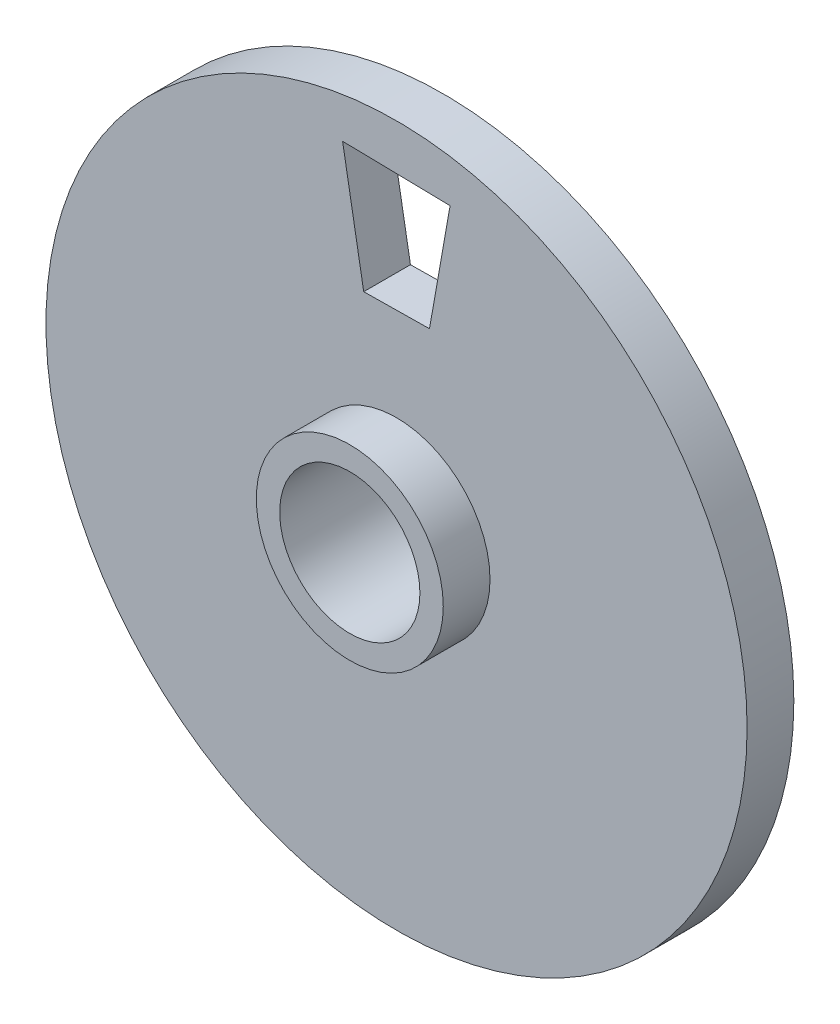
ISO-10303-21;
HEADER;
FILE_DESCRIPTION(('STEP AP214'),'2;1');
FILE_NAME('part.step','',(''),(''),'','','');
FILE_SCHEMA(('AUTOMOTIVE_DESIGN { 1 0 10303 214 1 1 1 1 }'));
ENDSEC;
DATA;
#1=APPLICATION_CONTEXT('core data for automotive mechanical design processes');
#2=APPLICATION_PROTOCOL_DEFINITION('international standard','automotive_design',2000,#1);
#3=PRODUCT_CONTEXT('',#1,'mechanical');
#4=PRODUCT('Part','Part','',(#3));
#5=PRODUCT_RELATED_PRODUCT_CATEGORY('part','',(#4));
#6=PRODUCT_DEFINITION_FORMATION('','',#4);
#7=PRODUCT_DEFINITION_CONTEXT('part definition',#1,'design');
#8=PRODUCT_DEFINITION('design','',#6,#7);
#9=PRODUCT_DEFINITION_SHAPE('','',#8);
#10=(LENGTH_UNIT() NAMED_UNIT(*) SI_UNIT(.MILLI.,.METRE.));
#11=(NAMED_UNIT(*) PLANE_ANGLE_UNIT() SI_UNIT($,.RADIAN.));
#12=(NAMED_UNIT(*) SI_UNIT($,.STERADIAN.) SOLID_ANGLE_UNIT());
#13=UNCERTAINTY_MEASURE_WITH_UNIT(LENGTH_MEASURE(1.E-05),#10,'distance_accuracy_value','');
#14=(GEOMETRIC_REPRESENTATION_CONTEXT(3) GLOBAL_UNCERTAINTY_ASSIGNED_CONTEXT((#13)) GLOBAL_UNIT_ASSIGNED_CONTEXT((#10,
#11,#12)) REPRESENTATION_CONTEXT('',''));
#15=CARTESIAN_POINT('',(0.,0.,0.));
#16=DIRECTION('',(0.,0.,1.));
#17=DIRECTION('',(1.,0.,0.));
#18=AXIS2_PLACEMENT_3D('',#15,#16,#17);
#19=CARTESIAN_POINT('',(0.,0.,4.));
#20=DIRECTION('',(0.,0.,1.));
#21=DIRECTION('',(1.,0.,0.));
#22=AXIS2_PLACEMENT_3D('',#19,#20,#21);
#23=PLANE('',#22);
#24=DIRECTION('',(0.173648177670117,0.984807753011646,0.));
#25=VECTOR('',#24,1.);
#26=CARTESIAN_POINT('',(2.29225074924466,13.,4.));
#27=LINE('',#26,#25);
#28=CARTESIAN_POINT('',(1.41061584568902,8.0000000000191,4.));
#29=VERTEX_POINT('',#28);
#30=CARTESIAN_POINT('',(2.29225074924466,13.,4.));
#31=VERTEX_POINT('',#30);
#32=EDGE_CURVE('E88',#29,#31,#27,.T.);
#33=ORIENTED_EDGE('',*,*,#32,.F.);
#34=DIRECTION('',(0.999915792669524,0.0129771942298062,0.));
#35=VECTOR('',#34,1.);
#36=CARTESIAN_POINT('',(1.41061584568902,8.0000000000191,4.));
#37=LINE('',#36,#35);
#38=CARTESIAN_POINT('',(-1.4041744171991,7.96346884387029,4.));
#39=VERTEX_POINT('',#38);
#40=EDGE_CURVE('E80',#39,#29,#37,.T.);
#41=ORIENTED_EDGE('',*,*,#40,.F.);
#42=DIRECTION('',(0.173648177666148,-0.984807753012346,0.));
#43=VECTOR('',#42,1.);
#44=CARTESIAN_POINT('',(-1.4041744171991,7.96346884387029,4.));
#45=LINE('',#44,#43);
#46=CARTESIAN_POINT('',(-2.3074497358179,13.0861977364863,4.));
#47=VERTEX_POINT('',#46);
#48=EDGE_CURVE('E103',#47,#39,#45,.T.);
#49=ORIENTED_EDGE('',*,*,#48,.F.);
#50=DIRECTION('',(-0.999824455085513,0.0187365688683103,0.));
#51=VECTOR('',#50,1.);
#52=CARTESIAN_POINT('',(-2.3074497358179,13.0861977364863,4.));
#53=LINE('',#52,#51);
#54=EDGE_CURVE('E101',#31,#47,#53,.T.);
#55=ORIENTED_EDGE('',*,*,#54,.F.);
#56=EDGE_LOOP('',(#33,#41,#49,#55));
#57=FACE_BOUND('',#56,.T.);
#58=CARTESIAN_POINT('',(0.,0.,4.));
#59=DIRECTION('',(0.,0.,1.));
#60=DIRECTION('',(1.,0.,0.));
#61=AXIS2_PLACEMENT_3D('',#58,#59,#60);
#62=CIRCLE('',#61,15.);
#63=CARTESIAN_POINT('',(15.,0.,4.));
#64=VERTEX_POINT('',#63);
#65=EDGE_CURVE('E119',#64,#64,#62,.T.);
#66=ORIENTED_EDGE('',*,*,#65,.T.);
#67=EDGE_LOOP('',(#66));
#68=FACE_BOUND('',#67,.T.);
#69=CARTESIAN_POINT('',(0.,0.,4.));
#70=DIRECTION('',(0.,0.,1.));
#71=DIRECTION('',(1.,0.,0.));
#72=AXIS2_PLACEMENT_3D('',#69,#70,#71);
#73=CIRCLE('',#72,4.);
#74=CARTESIAN_POINT('',(4.,0.,4.));
#75=VERTEX_POINT('',#74);
#76=EDGE_CURVE('E180',#75,#75,#73,.T.);
#77=ORIENTED_EDGE('',*,*,#76,.F.);
#78=EDGE_LOOP('',(#77));
#79=FACE_BOUND('',#78,.T.);
#80=ADVANCED_FACE('F39',(#57,#68,#79),#23,.T.);
#81=CARTESIAN_POINT('',(0.,0.,0.));
#82=DIRECTION('',(0.,0.,1.));
#83=DIRECTION('',(1.,0.,0.));
#84=AXIS2_PLACEMENT_3D('',#81,#82,#83);
#85=PLANE('',#84);
#86=CARTESIAN_POINT('',(0.,0.,0.));
#87=DIRECTION('',(0.,0.,1.));
#88=DIRECTION('',(1.,0.,0.));
#89=AXIS2_PLACEMENT_3D('',#86,#87,#88);
#90=CIRCLE('',#89,4.);
#91=CARTESIAN_POINT('',(4.,0.,0.));
#92=VERTEX_POINT('',#91);
#93=EDGE_CURVE('E43',#92,#92,#90,.T.);
#94=ORIENTED_EDGE('',*,*,#93,.F.);
#95=EDGE_LOOP('',(#94));
#96=FACE_BOUND('',#95,.T.);
#97=CARTESIAN_POINT('',(0.,0.,0.));
#98=DIRECTION('',(0.,0.,1.));
#99=DIRECTION('',(1.,0.,0.));
#100=AXIS2_PLACEMENT_3D('',#97,#98,#99);
#101=CIRCLE('',#100,3.);
#102=CARTESIAN_POINT('',(3.,0.,0.));
#103=VERTEX_POINT('',#102);
#104=EDGE_CURVE('E122',#103,#103,#101,.T.);
#105=ORIENTED_EDGE('',*,*,#104,.T.);
#106=EDGE_LOOP('',(#105));
#107=FACE_BOUND('',#106,.T.);
#108=ADVANCED_FACE('F132',(#96,#107),#85,.F.);
#109=CARTESIAN_POINT('',(0.,0.,2.));
#110=DIRECTION('',(0.,0.,-1.));
#111=DIRECTION('',(-1.,0.,0.));
#112=AXIS2_PLACEMENT_3D('',#109,#110,#111);
#113=CYLINDRICAL_SURFACE('',#112,4.);
#114=CARTESIAN_POINT('',(0.,0.,2.));
#115=DIRECTION('',(0.,0.,1.));
#116=DIRECTION('',(1.,0.,0.));
#117=AXIS2_PLACEMENT_3D('',#114,#115,#116);
#118=CIRCLE('',#117,4.);
#119=CARTESIAN_POINT('',(4.,0.,2.));
#120=VERTEX_POINT('',#119);
#121=EDGE_CURVE('E11',#120,#120,#118,.T.);
#122=ORIENTED_EDGE('',*,*,#121,.F.);
#123=EDGE_LOOP('',(#122));
#124=FACE_BOUND('',#123,.T.);
#125=ORIENTED_EDGE('',*,*,#93,.T.);
#126=EDGE_LOOP('',(#125));
#127=FACE_BOUND('',#126,.T.);
#128=ADVANCED_FACE('F41',(#124,#127),#113,.T.);
#129=CARTESIAN_POINT('',(0.,0.,2.));
#130=DIRECTION('',(0.,0.,-1.));
#131=DIRECTION('',(-1.,0.,0.));
#132=AXIS2_PLACEMENT_3D('',#129,#130,#131);
#133=CYLINDRICAL_SURFACE('',#132,3.);
#134=ORIENTED_EDGE('',*,*,#104,.F.);
#135=EDGE_LOOP('',(#134));
#136=FACE_BOUND('',#135,.T.);
#137=CARTESIAN_POINT('',(0.,0.,6.));
#138=DIRECTION('',(0.,0.,1.));
#139=DIRECTION('',(1.,0.,0.));
#140=AXIS2_PLACEMENT_3D('',#137,#138,#139);
#141=CIRCLE('',#140,3.);
#142=CARTESIAN_POINT('',(3.,0.,6.));
#143=VERTEX_POINT('',#142);
#144=EDGE_CURVE('E178',#143,#143,#141,.T.);
#145=ORIENTED_EDGE('',*,*,#144,.T.);
#146=EDGE_LOOP('',(#145));
#147=FACE_BOUND('',#146,.T.);
#148=ADVANCED_FACE('F138',(#136,#147),#133,.F.);
#149=CARTESIAN_POINT('',(0.,0.,2.));
#150=DIRECTION('',(0.,0.,1.));
#151=DIRECTION('',(1.,0.,0.));
#152=AXIS2_PLACEMENT_3D('',#149,#150,#151);
#153=PLANE('',#152);
#154=DIRECTION('',(0.999915792669524,0.0129771942298062,0.));
#155=VECTOR('',#154,1.);
#156=CARTESIAN_POINT('',(1.41061584568902,8.0000000000191,2.));
#157=LINE('',#156,#155);
#158=CARTESIAN_POINT('',(-1.4041744171991,7.9634688438703,2.));
#159=VERTEX_POINT('',#158);
#160=CARTESIAN_POINT('',(1.41061584568902,8.0000000000191,2.));
#161=VERTEX_POINT('',#160);
#162=EDGE_CURVE('E62',#159,#161,#157,.T.);
#163=ORIENTED_EDGE('',*,*,#162,.T.);
#164=DIRECTION('',(0.173648177670117,0.984807753011646,0.));
#165=VECTOR('',#164,1.);
#166=CARTESIAN_POINT('',(2.29225074924466,13.,2.));
#167=LINE('',#166,#165);
#168=CARTESIAN_POINT('',(2.29225074924466,13.,2.));
#169=VERTEX_POINT('',#168);
#170=EDGE_CURVE('E95',#161,#169,#167,.T.);
#171=ORIENTED_EDGE('',*,*,#170,.T.);
#172=DIRECTION('',(-0.999824455085513,0.0187365688683103,0.));
#173=VECTOR('',#172,1.);
#174=CARTESIAN_POINT('',(-2.3074497358179,13.0861977364863,2.));
#175=LINE('',#174,#173);
#176=CARTESIAN_POINT('',(-2.3074497358179,13.0861977364863,2.));
#177=VERTEX_POINT('',#176);
#178=EDGE_CURVE('E111',#169,#177,#175,.T.);
#179=ORIENTED_EDGE('',*,*,#178,.T.);
#180=DIRECTION('',(0.173648177666148,-0.984807753012346,0.));
#181=VECTOR('',#180,1.);
#182=CARTESIAN_POINT('',(-1.4041744171991,7.96346884387029,2.));
#183=LINE('',#182,#181);
#184=EDGE_CURVE('E89',#177,#159,#183,.T.);
#185=ORIENTED_EDGE('',*,*,#184,.T.);
#186=EDGE_LOOP('',(#163,#171,#179,#185));
#187=FACE_BOUND('',#186,.T.);
#188=CARTESIAN_POINT('',(0.,0.,2.));
#189=DIRECTION('',(0.,0.,1.));
#190=DIRECTION('',(1.,0.,0.));
#191=AXIS2_PLACEMENT_3D('',#188,#189,#190);
#192=CIRCLE('',#191,15.);
#193=CARTESIAN_POINT('',(15.,0.,2.));
#194=VERTEX_POINT('',#193);
#195=EDGE_CURVE('E96',#194,#194,#192,.T.);
#196=ORIENTED_EDGE('',*,*,#195,.F.);
#197=EDGE_LOOP('',(#196));
#198=FACE_BOUND('',#197,.T.);
#199=ORIENTED_EDGE('',*,*,#121,.T.);
#200=EDGE_LOOP('',(#199));
#201=FACE_BOUND('',#200,.T.);
#202=ADVANCED_FACE('F144',(#187,#198,#201),#153,.F.);
#203=CARTESIAN_POINT('',(0.,0.,4.));
#204=DIRECTION('',(0.,0.,-1.));
#205=DIRECTION('',(-1.,0.,0.));
#206=AXIS2_PLACEMENT_3D('',#203,#204,#205);
#207=CYLINDRICAL_SURFACE('',#206,15.);
#208=ORIENTED_EDGE('',*,*,#65,.F.);
#209=EDGE_LOOP('',(#208));
#210=FACE_BOUND('',#209,.T.);
#211=ORIENTED_EDGE('',*,*,#195,.T.);
#212=EDGE_LOOP('',(#211));
#213=FACE_BOUND('',#212,.T.);
#214=ADVANCED_FACE('F146',(#210,#213),#207,.T.);
#215=CARTESIAN_POINT('',(1.41061584568902,8.0000000000191,4.));
#216=DIRECTION('',(-0.0129771942298062,0.999915792669524,0.));
#217=DIRECTION('',(-0.999915792669524,-0.0129771942298062,0.));
#218=AXIS2_PLACEMENT_3D('',#215,#216,#217);
#219=PLANE('',#218);
#220=ORIENTED_EDGE('',*,*,#162,.F.);
#221=DIRECTION('',(0.,0.,-1.));
#222=VECTOR('',#221,1.);
#223=CARTESIAN_POINT('',(-1.4041744171991,7.96346884387029,4.));
#224=LINE('',#223,#222);
#225=EDGE_CURVE('E84',#39,#159,#224,.T.);
#226=ORIENTED_EDGE('',*,*,#225,.F.);
#227=ORIENTED_EDGE('',*,*,#40,.T.);
#228=DIRECTION('',(0.,0.,-1.));
#229=VECTOR('',#228,1.);
#230=CARTESIAN_POINT('',(1.41061584568902,8.0000000000191,4.));
#231=LINE('',#230,#229);
#232=EDGE_CURVE('E83',#29,#161,#231,.T.);
#233=ORIENTED_EDGE('',*,*,#232,.T.);
#234=EDGE_LOOP('',(#220,#226,#227,#233));
#235=FACE_BOUND('',#234,.T.);
#236=ADVANCED_FACE('F82',(#235),#219,.T.);
#237=CARTESIAN_POINT('',(2.29225074924466,13.,4.));
#238=DIRECTION('',(-0.984807753011646,0.173648177670117,0.));
#239=DIRECTION('',(-0.173648177670117,-0.984807753011646,0.));
#240=AXIS2_PLACEMENT_3D('',#237,#238,#239);
#241=PLANE('',#240);
#242=ORIENTED_EDGE('',*,*,#170,.F.);
#243=ORIENTED_EDGE('',*,*,#232,.F.);
#244=ORIENTED_EDGE('',*,*,#32,.T.);
#245=DIRECTION('',(0.,0.,-1.));
#246=VECTOR('',#245,1.);
#247=CARTESIAN_POINT('',(2.29225074924466,13.,4.));
#248=LINE('',#247,#246);
#249=EDGE_CURVE('E97',#31,#169,#248,.T.);
#250=ORIENTED_EDGE('',*,*,#249,.T.);
#251=EDGE_LOOP('',(#242,#243,#244,#250));
#252=FACE_BOUND('',#251,.T.);
#253=ADVANCED_FACE('F92',(#252),#241,.T.);
#254=CARTESIAN_POINT('',(-2.3074497358179,13.0861977364863,4.));
#255=DIRECTION('',(-0.0187365688683103,-0.999824455085513,0.));
#256=DIRECTION('',(0.999824455085513,-0.0187365688683103,0.));
#257=AXIS2_PLACEMENT_3D('',#254,#255,#256);
#258=PLANE('',#257);
#259=ORIENTED_EDGE('',*,*,#178,.F.);
#260=ORIENTED_EDGE('',*,*,#249,.F.);
#261=ORIENTED_EDGE('',*,*,#54,.T.);
#262=DIRECTION('',(0.,0.,-1.));
#263=VECTOR('',#262,1.);
#264=CARTESIAN_POINT('',(-2.3074497358179,13.0861977364863,4.));
#265=LINE('',#264,#263);
#266=EDGE_CURVE('E54',#47,#177,#265,.T.);
#267=ORIENTED_EDGE('',*,*,#266,.T.);
#268=EDGE_LOOP('',(#259,#260,#261,#267));
#269=FACE_BOUND('',#268,.T.);
#270=ADVANCED_FACE('F157',(#269),#258,.T.);
#271=CARTESIAN_POINT('',(-1.4041744171991,7.96346884387029,4.));
#272=DIRECTION('',(0.984807753012346,0.173648177666148,0.));
#273=DIRECTION('',(-0.173648177666148,0.984807753012346,0.));
#274=AXIS2_PLACEMENT_3D('',#271,#272,#273);
#275=PLANE('',#274);
#276=ORIENTED_EDGE('',*,*,#184,.F.);
#277=ORIENTED_EDGE('',*,*,#266,.F.);
#278=ORIENTED_EDGE('',*,*,#48,.T.);
#279=ORIENTED_EDGE('',*,*,#225,.T.);
#280=EDGE_LOOP('',(#276,#277,#278,#279));
#281=FACE_BOUND('',#280,.T.);
#282=ADVANCED_FACE('F160',(#281),#275,.T.);
#283=CARTESIAN_POINT('',(0.,0.,6.));
#284=DIRECTION('',(0.,0.,1.));
#285=DIRECTION('',(1.,0.,0.));
#286=AXIS2_PLACEMENT_3D('',#283,#284,#285);
#287=PLANE('',#286);
#288=CARTESIAN_POINT('',(0.,0.,6.));
#289=DIRECTION('',(0.,0.,1.));
#290=DIRECTION('',(1.,0.,0.));
#291=AXIS2_PLACEMENT_3D('',#288,#289,#290);
#292=CIRCLE('',#291,4.);
#293=CARTESIAN_POINT('',(4.,0.,6.));
#294=VERTEX_POINT('',#293);
#295=EDGE_CURVE('E109',#294,#294,#292,.T.);
#296=ORIENTED_EDGE('',*,*,#295,.T.);
#297=EDGE_LOOP('',(#296));
#298=FACE_BOUND('',#297,.T.);
#299=ORIENTED_EDGE('',*,*,#144,.F.);
#300=EDGE_LOOP('',(#299));
#301=FACE_BOUND('',#300,.T.);
#302=ADVANCED_FACE('F164',(#298,#301),#287,.T.);
#303=CARTESIAN_POINT('',(0.,0.,6.));
#304=DIRECTION('',(0.,0.,-1.));
#305=DIRECTION('',(-1.,0.,0.));
#306=AXIS2_PLACEMENT_3D('',#303,#304,#305);
#307=CYLINDRICAL_SURFACE('',#306,4.);
#308=ORIENTED_EDGE('',*,*,#295,.F.);
#309=EDGE_LOOP('',(#308));
#310=FACE_BOUND('',#309,.T.);
#311=ORIENTED_EDGE('',*,*,#76,.T.);
#312=EDGE_LOOP('',(#311));
#313=FACE_BOUND('',#312,.T.);
#314=ADVANCED_FACE('F165',(#310,#313),#307,.T.);
#315=CLOSED_SHELL('',(#80,#108,#128,#148,#202,#214,#236,#253,#270,#282,#302,#314));
#316=MANIFOLD_SOLID_BREP('B2',#315);
#317=ADVANCED_BREP_SHAPE_REPRESENTATION('',(#18,#316),#14);
#318=SHAPE_DEFINITION_REPRESENTATION(#9,#317);
ENDSEC;
END-ISO-10303-21;
